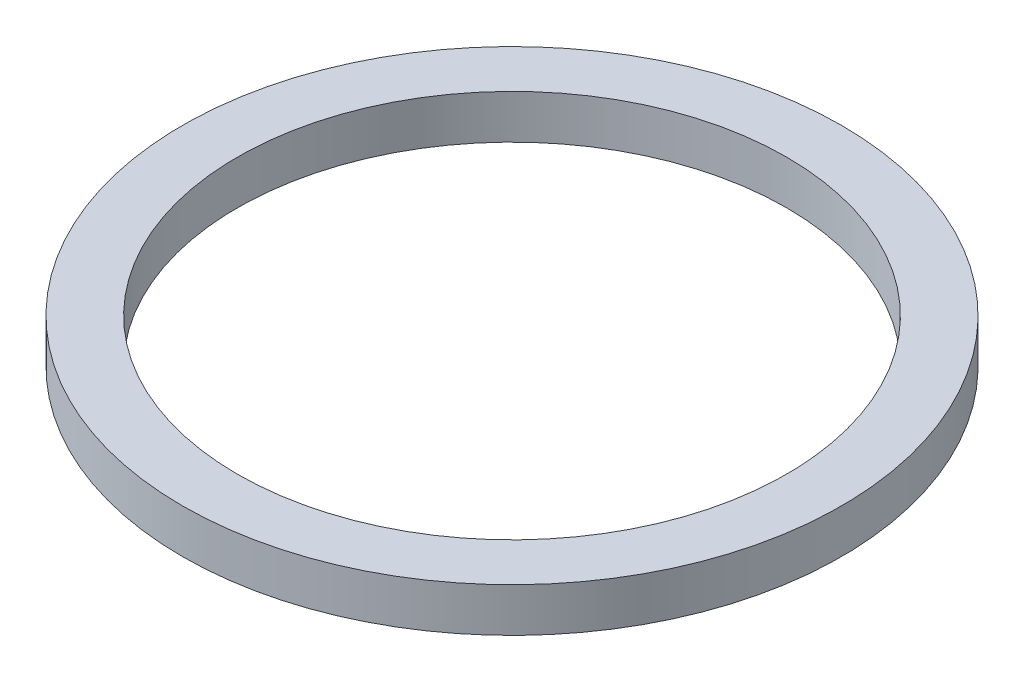
ISO-10303-21;
HEADER;
FILE_DESCRIPTION(('STEP AP214'),'2;1');
FILE_NAME('part.step','',(''),(''),'','','');
FILE_SCHEMA(('AUTOMOTIVE_DESIGN { 1 0 10303 214 1 1 1 1 }'));
ENDSEC;
DATA;
#1=APPLICATION_CONTEXT('core data for automotive mechanical design processes');
#2=APPLICATION_PROTOCOL_DEFINITION('international standard','automotive_design',2000,#1);
#3=PRODUCT_CONTEXT('',#1,'mechanical');
#4=PRODUCT('Part','Part','',(#3));
#5=PRODUCT_RELATED_PRODUCT_CATEGORY('part','',(#4));
#6=PRODUCT_DEFINITION_FORMATION('','',#4);
#7=PRODUCT_DEFINITION_CONTEXT('part definition',#1,'design');
#8=PRODUCT_DEFINITION('design','',#6,#7);
#9=PRODUCT_DEFINITION_SHAPE('','',#8);
#10=(LENGTH_UNIT() NAMED_UNIT(*) SI_UNIT(.MILLI.,.METRE.));
#11=(NAMED_UNIT(*) PLANE_ANGLE_UNIT() SI_UNIT($,.RADIAN.));
#12=(NAMED_UNIT(*) SI_UNIT($,.STERADIAN.) SOLID_ANGLE_UNIT());
#13=UNCERTAINTY_MEASURE_WITH_UNIT(LENGTH_MEASURE(1.E-05),#10,'distance_accuracy_value','');
#14=(GEOMETRIC_REPRESENTATION_CONTEXT(3) GLOBAL_UNCERTAINTY_ASSIGNED_CONTEXT((#13)) GLOBAL_UNIT_ASSIGNED_CONTEXT((#10,
#11,#12)) REPRESENTATION_CONTEXT('',''));
#15=CARTESIAN_POINT('',(0.,0.,0.));
#16=DIRECTION('',(0.,0.,1.));
#17=DIRECTION('',(1.,0.,0.));
#18=AXIS2_PLACEMENT_3D('',#15,#16,#17);
#19=CARTESIAN_POINT('',(0.,2.,0.));
#20=DIRECTION('',(0.,1.,0.));
#21=DIRECTION('',(0.,0.,1.));
#22=AXIS2_PLACEMENT_3D('',#19,#20,#21);
#23=PLANE('',#22);
#24=CARTESIAN_POINT('',(0.,2.,0.));
#25=DIRECTION('',(0.,1.,0.));
#26=DIRECTION('',(0.,0.,1.));
#27=AXIS2_PLACEMENT_3D('',#24,#25,#26);
#28=CIRCLE('',#27,15.);
#29=CARTESIAN_POINT('',(0.,2.,15.));
#30=VERTEX_POINT('',#29);
#31=EDGE_CURVE('E10',#30,#30,#28,.T.);
#32=ORIENTED_EDGE('',*,*,#31,.T.);
#33=EDGE_LOOP('',(#32));
#34=FACE_BOUND('',#33,.T.);
#35=CARTESIAN_POINT('',(0.,2.,0.));
#36=DIRECTION('',(0.,1.,0.));
#37=DIRECTION('',(0.,0.,1.));
#38=AXIS2_PLACEMENT_3D('',#35,#36,#37);
#39=CIRCLE('',#38,12.5);
#40=CARTESIAN_POINT('',(0.,2.,12.5));
#41=VERTEX_POINT('',#40);
#42=EDGE_CURVE('E48',#41,#41,#39,.T.);
#43=ORIENTED_EDGE('',*,*,#42,.F.);
#44=EDGE_LOOP('',(#43));
#45=FACE_BOUND('',#44,.T.);
#46=ADVANCED_FACE('F37',(#34,#45),#23,.T.);
#47=CARTESIAN_POINT('',(0.,0.,0.));
#48=DIRECTION('',(0.,1.,0.));
#49=DIRECTION('',(0.,0.,1.));
#50=AXIS2_PLACEMENT_3D('',#47,#48,#49);
#51=PLANE('',#50);
#52=CARTESIAN_POINT('',(0.,0.,0.));
#53=DIRECTION('',(0.,1.,0.));
#54=DIRECTION('',(0.,0.,1.));
#55=AXIS2_PLACEMENT_3D('',#52,#53,#54);
#56=CIRCLE('',#55,15.);
#57=CARTESIAN_POINT('',(0.,0.,15.));
#58=VERTEX_POINT('',#57);
#59=EDGE_CURVE('E41',#58,#58,#56,.T.);
#60=ORIENTED_EDGE('',*,*,#59,.F.);
#61=EDGE_LOOP('',(#60));
#62=FACE_BOUND('',#61,.T.);
#63=CARTESIAN_POINT('',(0.,0.,0.));
#64=DIRECTION('',(0.,1.,0.));
#65=DIRECTION('',(0.,0.,1.));
#66=AXIS2_PLACEMENT_3D('',#63,#64,#65);
#67=CIRCLE('',#66,12.5);
#68=CARTESIAN_POINT('',(0.,0.,12.5));
#69=VERTEX_POINT('',#68);
#70=EDGE_CURVE('E50',#69,#69,#67,.T.);
#71=ORIENTED_EDGE('',*,*,#70,.T.);
#72=EDGE_LOOP('',(#71));
#73=FACE_BOUND('',#72,.T.);
#74=ADVANCED_FACE('F60',(#62,#73),#51,.F.);
#75=CARTESIAN_POINT('',(0.,2.,0.));
#76=DIRECTION('',(0.,-1.,0.));
#77=DIRECTION('',(0.,0.,-1.));
#78=AXIS2_PLACEMENT_3D('',#75,#76,#77);
#79=CYLINDRICAL_SURFACE('',#78,15.);
#80=ORIENTED_EDGE('',*,*,#31,.F.);
#81=EDGE_LOOP('',(#80));
#82=FACE_BOUND('',#81,.T.);
#83=ORIENTED_EDGE('',*,*,#59,.T.);
#84=EDGE_LOOP('',(#83));
#85=FACE_BOUND('',#84,.T.);
#86=ADVANCED_FACE('F39',(#82,#85),#79,.T.);
#87=CARTESIAN_POINT('',(0.,2.,0.));
#88=DIRECTION('',(0.,-1.,0.));
#89=DIRECTION('',(0.,0.,-1.));
#90=AXIS2_PLACEMENT_3D('',#87,#88,#89);
#91=CYLINDRICAL_SURFACE('',#90,12.5);
#92=ORIENTED_EDGE('',*,*,#42,.T.);
#93=EDGE_LOOP('',(#92));
#94=FACE_BOUND('',#93,.T.);
#95=ORIENTED_EDGE('',*,*,#70,.F.);
#96=EDGE_LOOP('',(#95));
#97=FACE_BOUND('',#96,.T.);
#98=ADVANCED_FACE('F56',(#94,#97),#91,.F.);
#99=CLOSED_SHELL('',(#46,#74,#86,#98));
#100=MANIFOLD_SOLID_BREP('B2',#99);
#101=ADVANCED_BREP_SHAPE_REPRESENTATION('',(#18,#100),#14);
#102=SHAPE_DEFINITION_REPRESENTATION(#9,#101);
ENDSEC;
END-ISO-10303-21;
